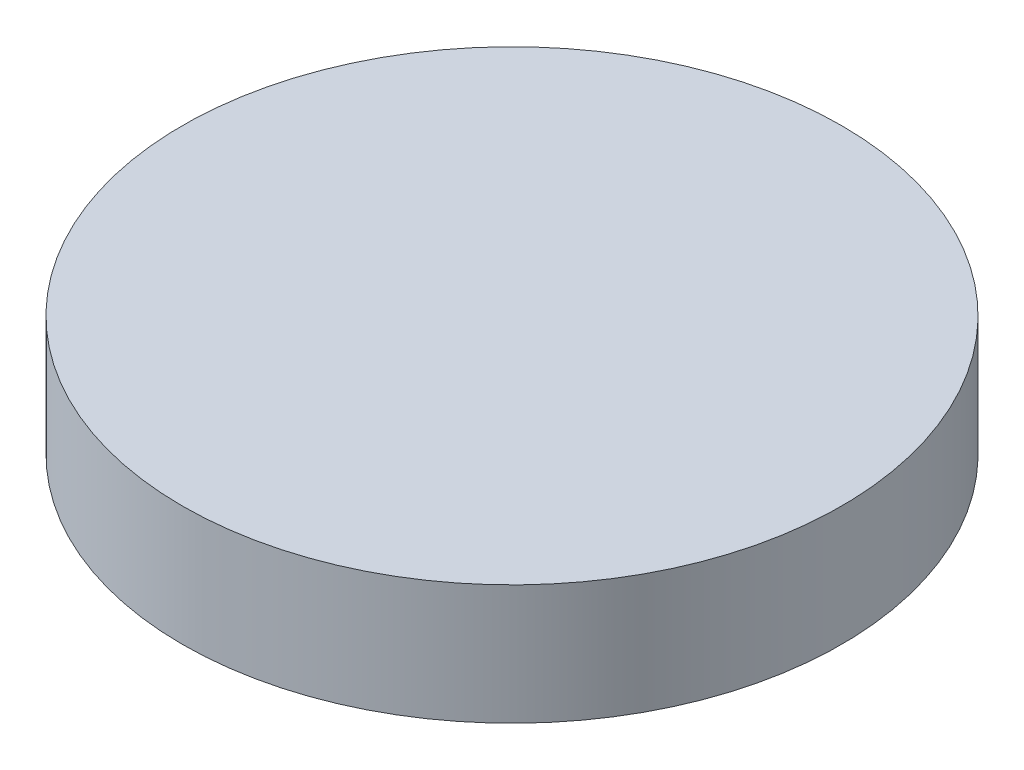
ISO-10303-21;
HEADER;
FILE_DESCRIPTION(('STEP AP214'),'2;1');
FILE_NAME('part.step','',(''),(''),'','','');
FILE_SCHEMA(('AUTOMOTIVE_DESIGN { 1 0 10303 214 1 1 1 1 }'));
ENDSEC;
DATA;
#1=APPLICATION_CONTEXT('core data for automotive mechanical design processes');
#2=APPLICATION_PROTOCOL_DEFINITION('international standard','automotive_design',2000,#1);
#3=PRODUCT_CONTEXT('',#1,'mechanical');
#4=PRODUCT('Part','Part','',(#3));
#5=PRODUCT_RELATED_PRODUCT_CATEGORY('part','',(#4));
#6=PRODUCT_DEFINITION_FORMATION('','',#4);
#7=PRODUCT_DEFINITION_CONTEXT('part definition',#1,'design');
#8=PRODUCT_DEFINITION('design','',#6,#7);
#9=PRODUCT_DEFINITION_SHAPE('','',#8);
#10=(LENGTH_UNIT() NAMED_UNIT(*) SI_UNIT(.MILLI.,.METRE.));
#11=(NAMED_UNIT(*) PLANE_ANGLE_UNIT() SI_UNIT($,.RADIAN.));
#12=(NAMED_UNIT(*) SI_UNIT($,.STERADIAN.) SOLID_ANGLE_UNIT());
#13=UNCERTAINTY_MEASURE_WITH_UNIT(LENGTH_MEASURE(1.E-05),#10,'distance_accuracy_value','');
#14=(GEOMETRIC_REPRESENTATION_CONTEXT(3) GLOBAL_UNCERTAINTY_ASSIGNED_CONTEXT((#13)) GLOBAL_UNIT_ASSIGNED_CONTEXT((#10,
#11,#12)) REPRESENTATION_CONTEXT('',''));
#15=CARTESIAN_POINT('',(0.,0.,0.));
#16=DIRECTION('',(0.,0.,1.));
#17=DIRECTION('',(1.,0.,0.));
#18=AXIS2_PLACEMENT_3D('',#15,#16,#17);
#19=CARTESIAN_POINT('',(0.,10.,0.));
#20=DIRECTION('',(0.,-1.,0.));
#21=DIRECTION('',(0.,0.,-1.));
#22=AXIS2_PLACEMENT_3D('',#19,#20,#21);
#23=CYLINDRICAL_SURFACE('',#22,27.5);
#24=CARTESIAN_POINT('',(0.,10.,0.));
#25=DIRECTION('',(0.,1.,0.));
#26=DIRECTION('',(0.,0.,1.));
#27=AXIS2_PLACEMENT_3D('',#24,#25,#26);
#28=CIRCLE('',#27,27.5);
#29=CARTESIAN_POINT('',(0.,10.,27.5));
#30=VERTEX_POINT('',#29);
#31=EDGE_CURVE('E10',#30,#30,#28,.T.);
#32=ORIENTED_EDGE('',*,*,#31,.F.);
#33=EDGE_LOOP('',(#32));
#34=FACE_BOUND('',#33,.T.);
#35=CARTESIAN_POINT('',(0.,0.,0.));
#36=DIRECTION('',(0.,1.,0.));
#37=DIRECTION('',(0.,0.,1.));
#38=AXIS2_PLACEMENT_3D('',#35,#36,#37);
#39=CIRCLE('',#38,27.5);
#40=CARTESIAN_POINT('',(0.,0.,27.5));
#41=VERTEX_POINT('',#40);
#42=EDGE_CURVE('E40',#41,#41,#39,.T.);
#43=ORIENTED_EDGE('',*,*,#42,.T.);
#44=EDGE_LOOP('',(#43));
#45=FACE_BOUND('',#44,.T.);
#46=ADVANCED_FACE('F37',(#34,#45),#23,.T.);
#47=CARTESIAN_POINT('',(0.,10.,0.));
#48=DIRECTION('',(0.,1.,0.));
#49=DIRECTION('',(0.,0.,1.));
#50=AXIS2_PLACEMENT_3D('',#47,#48,#49);
#51=PLANE('',#50);
#52=ORIENTED_EDGE('',*,*,#31,.T.);
#53=EDGE_LOOP('',(#52));
#54=FACE_BOUND('',#53,.T.);
#55=ADVANCED_FACE('F54',(#54),#51,.T.);
#56=CARTESIAN_POINT('',(0.,0.,0.));
#57=DIRECTION('',(0.,1.,0.));
#58=DIRECTION('',(0.,0.,1.));
#59=AXIS2_PLACEMENT_3D('',#56,#57,#58);
#60=PLANE('',#59);
#61=ORIENTED_EDGE('',*,*,#42,.F.);
#62=EDGE_LOOP('',(#61));
#63=FACE_BOUND('',#62,.T.);
#64=ADVANCED_FACE('F52',(#63),#60,.F.);
#65=CLOSED_SHELL('',(#46,#55,#64));
#66=MANIFOLD_SOLID_BREP('B2',#65);
#67=ADVANCED_BREP_SHAPE_REPRESENTATION('',(#18,#66),#14);
#68=SHAPE_DEFINITION_REPRESENTATION(#9,#67);
ENDSEC;
END-ISO-10303-21;
